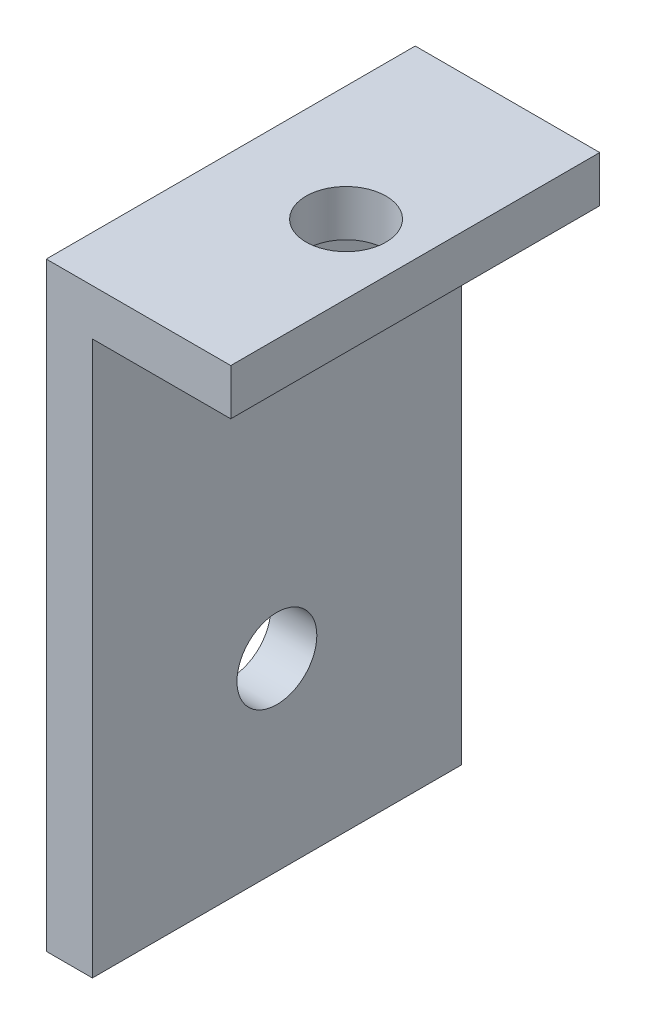
ISO-10303-21;
HEADER;
FILE_DESCRIPTION(('STEP AP214'),'2;1');
FILE_NAME('part.step','',(''),(''),'','','');
FILE_SCHEMA(('AUTOMOTIVE_DESIGN { 1 0 10303 214 1 1 1 1 }'));
ENDSEC;
DATA;
#1=APPLICATION_CONTEXT('core data for automotive mechanical design processes');
#2=APPLICATION_PROTOCOL_DEFINITION('international standard','automotive_design',2000,#1);
#3=PRODUCT_CONTEXT('',#1,'mechanical');
#4=PRODUCT('Part','Part','',(#3));
#5=PRODUCT_RELATED_PRODUCT_CATEGORY('part','',(#4));
#6=PRODUCT_DEFINITION_FORMATION('','',#4);
#7=PRODUCT_DEFINITION_CONTEXT('part definition',#1,'design');
#8=PRODUCT_DEFINITION('design','',#6,#7);
#9=PRODUCT_DEFINITION_SHAPE('','',#8);
#10=(LENGTH_UNIT() NAMED_UNIT(*) SI_UNIT(.MILLI.,.METRE.));
#11=(NAMED_UNIT(*) PLANE_ANGLE_UNIT() SI_UNIT($,.RADIAN.));
#12=(NAMED_UNIT(*) SI_UNIT($,.STERADIAN.) SOLID_ANGLE_UNIT());
#13=UNCERTAINTY_MEASURE_WITH_UNIT(LENGTH_MEASURE(1.E-05),#10,'distance_accuracy_value','');
#14=(GEOMETRIC_REPRESENTATION_CONTEXT(3) GLOBAL_UNCERTAINTY_ASSIGNED_CONTEXT((#13)) GLOBAL_UNIT_ASSIGNED_CONTEXT((#10,
#11,#12)) REPRESENTATION_CONTEXT('',''));
#15=CARTESIAN_POINT('',(0.,0.,0.));
#16=DIRECTION('',(0.,0.,1.));
#17=DIRECTION('',(1.,0.,0.));
#18=AXIS2_PLACEMENT_3D('',#15,#16,#17);
#19=CARTESIAN_POINT('',(3.175,0.,25.4));
#20=DIRECTION('',(0.,1.,0.));
#21=DIRECTION('',(-1.,0.,0.));
#22=AXIS2_PLACEMENT_3D('',#19,#20,#21);
#23=PLANE('',#22);
#24=DIRECTION('',(1.,0.,0.));
#25=VECTOR('',#24,1.);
#26=CARTESIAN_POINT('',(3.175,0.,0.));
#27=LINE('',#26,#25);
#28=CARTESIAN_POINT('',(0.,0.,0.));
#29=VERTEX_POINT('',#28);
#30=CARTESIAN_POINT('',(3.175,0.,0.));
#31=VERTEX_POINT('',#30);
#32=EDGE_CURVE('E117',#29,#31,#27,.T.);
#33=ORIENTED_EDGE('',*,*,#32,.T.);
#34=DIRECTION('',(0.,0.,-1.));
#35=VECTOR('',#34,1.);
#36=CARTESIAN_POINT('',(3.175,0.,25.4));
#37=LINE('',#36,#35);
#38=CARTESIAN_POINT('',(3.175,0.,25.4));
#39=VERTEX_POINT('',#38);
#40=EDGE_CURVE('E11',#39,#31,#37,.T.);
#41=ORIENTED_EDGE('',*,*,#40,.F.);
#42=DIRECTION('',(1.,0.,0.));
#43=VECTOR('',#42,1.);
#44=CARTESIAN_POINT('',(3.175,0.,25.4));
#45=LINE('',#44,#43);
#46=CARTESIAN_POINT('',(0.,0.,25.4));
#47=VERTEX_POINT('',#46);
#48=EDGE_CURVE('E128',#47,#39,#45,.T.);
#49=ORIENTED_EDGE('',*,*,#48,.F.);
#50=DIRECTION('',(0.,0.,-1.));
#51=VECTOR('',#50,1.);
#52=CARTESIAN_POINT('',(0.,0.,25.4));
#53=LINE('',#52,#51);
#54=EDGE_CURVE('E113',#47,#29,#53,.T.);
#55=ORIENTED_EDGE('',*,*,#54,.T.);
#56=EDGE_LOOP('',(#33,#41,#49,#55));
#57=FACE_BOUND('',#56,.T.);
#58=ADVANCED_FACE('F33',(#57),#23,.F.);
#59=CARTESIAN_POINT('',(3.17499999999999,38.1,25.4));
#60=DIRECTION('',(-1.,0.,0.));
#61=DIRECTION('',(0.,-1.,0.));
#62=AXIS2_PLACEMENT_3D('',#59,#60,#61);
#63=PLANE('',#62);
#64=CARTESIAN_POINT('',(3.175,12.7,12.7));
#65=DIRECTION('',(1.,0.,0.));
#66=DIRECTION('',(0.,0.,-1.));
#67=AXIS2_PLACEMENT_3D('',#64,#65,#66);
#68=CIRCLE('',#67,2.74999999999999);
#69=CARTESIAN_POINT('',(3.175,12.7,9.95000000000001));
#70=VERTEX_POINT('',#69);
#71=EDGE_CURVE('E219',#70,#70,#68,.T.);
#72=ORIENTED_EDGE('',*,*,#71,.F.);
#73=EDGE_LOOP('',(#72));
#74=FACE_BOUND('',#73,.T.);
#75=DIRECTION('',(0.,1.,0.));
#76=VECTOR('',#75,1.);
#77=CARTESIAN_POINT('',(3.17499999999999,38.1,0.));
#78=LINE('',#77,#76);
#79=CARTESIAN_POINT('',(3.17499999999999,38.1,0.));
#80=VERTEX_POINT('',#79);
#81=EDGE_CURVE('E120',#31,#80,#78,.T.);
#82=ORIENTED_EDGE('',*,*,#81,.T.);
#83=DIRECTION('',(0.,0.,-1.));
#84=VECTOR('',#83,1.);
#85=CARTESIAN_POINT('',(3.17499999999999,38.1,25.4));
#86=LINE('',#85,#84);
#87=CARTESIAN_POINT('',(3.17499999999999,38.1,25.4));
#88=VERTEX_POINT('',#87);
#89=EDGE_CURVE('E41',#88,#80,#86,.T.);
#90=ORIENTED_EDGE('',*,*,#89,.F.);
#91=DIRECTION('',(0.,1.,0.));
#92=VECTOR('',#91,1.);
#93=CARTESIAN_POINT('',(3.17499999999999,38.1,25.4));
#94=LINE('',#93,#92);
#95=EDGE_CURVE('E86',#39,#88,#94,.T.);
#96=ORIENTED_EDGE('',*,*,#95,.F.);
#97=ORIENTED_EDGE('',*,*,#40,.T.);
#98=EDGE_LOOP('',(#82,#90,#96,#97));
#99=FACE_BOUND('',#98,.T.);
#100=ADVANCED_FACE('F157',(#74,#99),#63,.F.);
#101=CARTESIAN_POINT('',(12.7,38.1,25.4));
#102=DIRECTION('',(0.,1.,0.));
#103=DIRECTION('',(0.,0.,1.));
#104=AXIS2_PLACEMENT_3D('',#101,#102,#103);
#105=PLANE('',#104);
#106=CARTESIAN_POINT('',(7.9375,38.1,12.7));
#107=DIRECTION('',(0.,-1.,0.));
#108=DIRECTION('',(0.,0.,-1.));
#109=AXIS2_PLACEMENT_3D('',#106,#107,#108);
#110=CIRCLE('',#109,2.74999999999999);
#111=CARTESIAN_POINT('',(7.9375,38.1,9.95000000000001));
#112=VERTEX_POINT('',#111);
#113=EDGE_CURVE('E221',#112,#112,#110,.T.);
#114=ORIENTED_EDGE('',*,*,#113,.F.);
#115=EDGE_LOOP('',(#114));
#116=FACE_BOUND('',#115,.T.);
#117=DIRECTION('',(1.,0.,0.));
#118=VECTOR('',#117,1.);
#119=CARTESIAN_POINT('',(12.7,38.1,0.));
#120=LINE('',#119,#118);
#121=CARTESIAN_POINT('',(12.7,38.1,0.));
#122=VERTEX_POINT('',#121);
#123=EDGE_CURVE('E123',#80,#122,#120,.T.);
#124=ORIENTED_EDGE('',*,*,#123,.T.);
#125=DIRECTION('',(0.,0.,-1.));
#126=VECTOR('',#125,1.);
#127=CARTESIAN_POINT('',(12.7,38.1,25.4));
#128=LINE('',#127,#126);
#129=CARTESIAN_POINT('',(12.7,38.1,25.4));
#130=VERTEX_POINT('',#129);
#131=EDGE_CURVE('E108',#130,#122,#128,.T.);
#132=ORIENTED_EDGE('',*,*,#131,.F.);
#133=DIRECTION('',(1.,0.,0.));
#134=VECTOR('',#133,1.);
#135=CARTESIAN_POINT('',(12.7,38.1,25.4));
#136=LINE('',#135,#134);
#137=EDGE_CURVE('E99',#88,#130,#136,.T.);
#138=ORIENTED_EDGE('',*,*,#137,.F.);
#139=ORIENTED_EDGE('',*,*,#89,.T.);
#140=EDGE_LOOP('',(#124,#132,#138,#139));
#141=FACE_BOUND('',#140,.T.);
#142=ADVANCED_FACE('F134',(#116,#141),#105,.F.);
#143=CARTESIAN_POINT('',(12.7,41.275,25.4));
#144=DIRECTION('',(-1.,0.,0.));
#145=DIRECTION('',(0.,0.,1.));
#146=AXIS2_PLACEMENT_3D('',#143,#144,#145);
#147=PLANE('',#146);
#148=DIRECTION('',(0.,1.,0.));
#149=VECTOR('',#148,1.);
#150=CARTESIAN_POINT('',(12.7,41.275,0.));
#151=LINE('',#150,#149);
#152=CARTESIAN_POINT('',(12.7,41.275,0.));
#153=VERTEX_POINT('',#152);
#154=EDGE_CURVE('E107',#122,#153,#151,.T.);
#155=ORIENTED_EDGE('',*,*,#154,.T.);
#156=DIRECTION('',(0.,0.,-1.));
#157=VECTOR('',#156,1.);
#158=CARTESIAN_POINT('',(12.7,41.275,25.4));
#159=LINE('',#158,#157);
#160=CARTESIAN_POINT('',(12.7,41.275,25.4));
#161=VERTEX_POINT('',#160);
#162=EDGE_CURVE('E104',#161,#153,#159,.T.);
#163=ORIENTED_EDGE('',*,*,#162,.F.);
#164=DIRECTION('',(0.,1.,0.));
#165=VECTOR('',#164,1.);
#166=CARTESIAN_POINT('',(12.7,41.275,25.4));
#167=LINE('',#166,#165);
#168=EDGE_CURVE('E93',#130,#161,#167,.T.);
#169=ORIENTED_EDGE('',*,*,#168,.F.);
#170=ORIENTED_EDGE('',*,*,#131,.T.);
#171=EDGE_LOOP('',(#155,#163,#169,#170));
#172=FACE_BOUND('',#171,.T.);
#173=ADVANCED_FACE('F105',(#172),#147,.F.);
#174=CARTESIAN_POINT('',(0.,41.275,25.4));
#175=DIRECTION('',(0.,-1.,0.));
#176=DIRECTION('',(0.,0.,-1.));
#177=AXIS2_PLACEMENT_3D('',#174,#175,#176);
#178=PLANE('',#177);
#179=CARTESIAN_POINT('',(7.9375,41.275,12.7));
#180=DIRECTION('',(0.,-1.,0.));
#181=DIRECTION('',(0.,0.,-1.));
#182=AXIS2_PLACEMENT_3D('',#179,#180,#181);
#183=CIRCLE('',#182,2.74999999999999);
#184=CARTESIAN_POINT('',(7.9375,41.275,9.95000000000001));
#185=VERTEX_POINT('',#184);
#186=EDGE_CURVE('E121',#185,#185,#183,.T.);
#187=ORIENTED_EDGE('',*,*,#186,.T.);
#188=EDGE_LOOP('',(#187));
#189=FACE_BOUND('',#188,.T.);
#190=DIRECTION('',(-1.,0.,0.));
#191=VECTOR('',#190,1.);
#192=CARTESIAN_POINT('',(0.,41.275,0.));
#193=LINE('',#192,#191);
#194=CARTESIAN_POINT('',(0.,41.275,0.));
#195=VERTEX_POINT('',#194);
#196=EDGE_CURVE('E72',#153,#195,#193,.T.);
#197=ORIENTED_EDGE('',*,*,#196,.T.);
#198=DIRECTION('',(0.,0.,-1.));
#199=VECTOR('',#198,1.);
#200=CARTESIAN_POINT('',(0.,41.275,25.4));
#201=LINE('',#200,#199);
#202=CARTESIAN_POINT('',(0.,41.275,25.4));
#203=VERTEX_POINT('',#202);
#204=EDGE_CURVE('E109',#203,#195,#201,.T.);
#205=ORIENTED_EDGE('',*,*,#204,.F.);
#206=DIRECTION('',(-1.,0.,0.));
#207=VECTOR('',#206,1.);
#208=CARTESIAN_POINT('',(0.,41.275,25.4));
#209=LINE('',#208,#207);
#210=EDGE_CURVE('E97',#161,#203,#209,.T.);
#211=ORIENTED_EDGE('',*,*,#210,.F.);
#212=ORIENTED_EDGE('',*,*,#162,.T.);
#213=EDGE_LOOP('',(#197,#205,#211,#212));
#214=FACE_BOUND('',#213,.T.);
#215=ADVANCED_FACE('F111',(#189,#214),#178,.F.);
#216=CARTESIAN_POINT('',(0.,0.,25.4));
#217=DIRECTION('',(1.,0.,0.));
#218=DIRECTION('',(0.,0.,-1.));
#219=AXIS2_PLACEMENT_3D('',#216,#217,#218);
#220=PLANE('',#219);
#221=CARTESIAN_POINT('',(0.,12.7,12.7));
#222=DIRECTION('',(1.,0.,0.));
#223=DIRECTION('',(0.,0.,-1.));
#224=AXIS2_PLACEMENT_3D('',#221,#222,#223);
#225=CIRCLE('',#224,2.74999999999999);
#226=CARTESIAN_POINT('',(0.,12.7,9.95000000000001));
#227=VERTEX_POINT('',#226);
#228=EDGE_CURVE('E217',#227,#227,#225,.T.);
#229=ORIENTED_EDGE('',*,*,#228,.T.);
#230=EDGE_LOOP('',(#229));
#231=FACE_BOUND('',#230,.T.);
#232=DIRECTION('',(0.,-1.,0.));
#233=VECTOR('',#232,1.);
#234=CARTESIAN_POINT('',(0.,0.,0.));
#235=LINE('',#234,#233);
#236=EDGE_CURVE('E78',#195,#29,#235,.T.);
#237=ORIENTED_EDGE('',*,*,#236,.T.);
#238=ORIENTED_EDGE('',*,*,#54,.F.);
#239=DIRECTION('',(0.,-1.,0.));
#240=VECTOR('',#239,1.);
#241=CARTESIAN_POINT('',(0.,0.,25.4));
#242=LINE('',#241,#240);
#243=EDGE_CURVE('E49',#203,#47,#242,.T.);
#244=ORIENTED_EDGE('',*,*,#243,.F.);
#245=ORIENTED_EDGE('',*,*,#204,.T.);
#246=EDGE_LOOP('',(#237,#238,#244,#245));
#247=FACE_BOUND('',#246,.T.);
#248=ADVANCED_FACE('F141',(#231,#247),#220,.F.);
#249=CARTESIAN_POINT('',(0.,0.,25.4));
#250=DIRECTION('',(0.,0.,-1.));
#251=DIRECTION('',(-1.,0.,0.));
#252=AXIS2_PLACEMENT_3D('',#249,#250,#251);
#253=PLANE('',#252);
#254=ORIENTED_EDGE('',*,*,#48,.T.);
#255=ORIENTED_EDGE('',*,*,#95,.T.);
#256=ORIENTED_EDGE('',*,*,#137,.T.);
#257=ORIENTED_EDGE('',*,*,#168,.T.);
#258=ORIENTED_EDGE('',*,*,#210,.T.);
#259=ORIENTED_EDGE('',*,*,#243,.T.);
#260=EDGE_LOOP('',(#254,#255,#256,#257,#258,#259));
#261=FACE_BOUND('',#260,.T.);
#262=ADVANCED_FACE('F95',(#261),#253,.F.);
#263=CARTESIAN_POINT('',(0.,0.,0.));
#264=DIRECTION('',(0.,0.,-1.));
#265=DIRECTION('',(-1.,0.,0.));
#266=AXIS2_PLACEMENT_3D('',#263,#264,#265);
#267=PLANE('',#266);
#268=ORIENTED_EDGE('',*,*,#32,.F.);
#269=ORIENTED_EDGE('',*,*,#236,.F.);
#270=ORIENTED_EDGE('',*,*,#196,.F.);
#271=ORIENTED_EDGE('',*,*,#154,.F.);
#272=ORIENTED_EDGE('',*,*,#123,.F.);
#273=ORIENTED_EDGE('',*,*,#81,.F.);
#274=EDGE_LOOP('',(#268,#269,#270,#271,#272,#273));
#275=FACE_BOUND('',#274,.T.);
#276=ADVANCED_FACE('F137',(#275),#267,.T.);
#277=CARTESIAN_POINT('',(7.9375,38.1,12.7));
#278=DIRECTION('',(0.,-1.,0.));
#279=DIRECTION('',(0.,0.,-1.));
#280=AXIS2_PLACEMENT_3D('',#277,#278,#279);
#281=CYLINDRICAL_SURFACE('',#280,2.74999999999999);
#282=ORIENTED_EDGE('',*,*,#186,.F.);
#283=EDGE_LOOP('',(#282));
#284=FACE_BOUND('',#283,.T.);
#285=ORIENTED_EDGE('',*,*,#113,.T.);
#286=EDGE_LOOP('',(#285));
#287=FACE_BOUND('',#286,.T.);
#288=ADVANCED_FACE('F192',(#284,#287),#281,.F.);
#289=CARTESIAN_POINT('',(3.175,12.7,12.7));
#290=DIRECTION('',(1.,0.,0.));
#291=DIRECTION('',(0.,0.,-1.));
#292=AXIS2_PLACEMENT_3D('',#289,#290,#291);
#293=CYLINDRICAL_SURFACE('',#292,2.74999999999999);
#294=ORIENTED_EDGE('',*,*,#228,.F.);
#295=EDGE_LOOP('',(#294));
#296=FACE_BOUND('',#295,.T.);
#297=ORIENTED_EDGE('',*,*,#71,.T.);
#298=EDGE_LOOP('',(#297));
#299=FACE_BOUND('',#298,.T.);
#300=ADVANCED_FACE('F197',(#296,#299),#293,.F.);
#301=CLOSED_SHELL('',(#58,#100,#142,#173,#215,#248,#262,#276,#288,#300));
#302=MANIFOLD_SOLID_BREP('B2',#301);
#303=ADVANCED_BREP_SHAPE_REPRESENTATION('',(#18,#302),#14);
#304=SHAPE_DEFINITION_REPRESENTATION(#9,#303);
ENDSEC;
END-ISO-10303-21;
